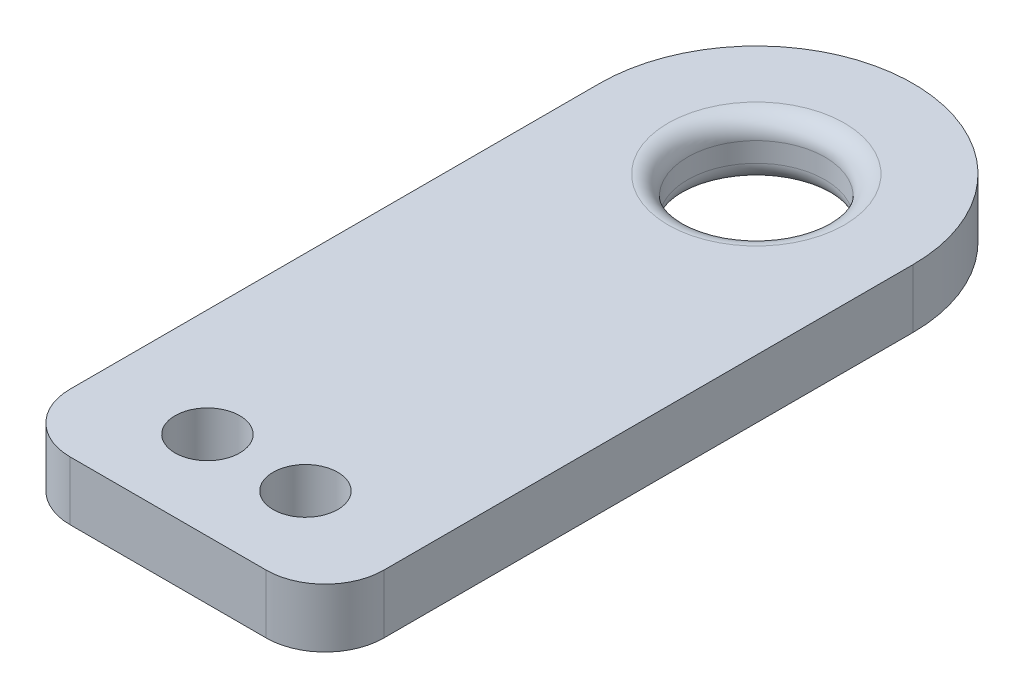
ISO-10303-21;
HEADER;
FILE_DESCRIPTION(('STEP AP214'),'2;1');
FILE_NAME('part.step','',(''),(''),'','','');
FILE_SCHEMA(('AUTOMOTIVE_DESIGN { 1 0 10303 214 1 1 1 1 }'));
ENDSEC;
DATA;
#1=APPLICATION_CONTEXT('core data for automotive mechanical design processes');
#2=APPLICATION_PROTOCOL_DEFINITION('international standard','automotive_design',2000,#1);
#3=PRODUCT_CONTEXT('',#1,'mechanical');
#4=PRODUCT('Part','Part','',(#3));
#5=PRODUCT_RELATED_PRODUCT_CATEGORY('part','',(#4));
#6=PRODUCT_DEFINITION_FORMATION('','',#4);
#7=PRODUCT_DEFINITION_CONTEXT('part definition',#1,'design');
#8=PRODUCT_DEFINITION('design','',#6,#7);
#9=PRODUCT_DEFINITION_SHAPE('','',#8);
#10=(LENGTH_UNIT() NAMED_UNIT(*) SI_UNIT(.MILLI.,.METRE.));
#11=(NAMED_UNIT(*) PLANE_ANGLE_UNIT() SI_UNIT($,.RADIAN.));
#12=(NAMED_UNIT(*) SI_UNIT($,.STERADIAN.) SOLID_ANGLE_UNIT());
#13=UNCERTAINTY_MEASURE_WITH_UNIT(LENGTH_MEASURE(1.E-05),#10,'distance_accuracy_value','');
#14=(GEOMETRIC_REPRESENTATION_CONTEXT(3) GLOBAL_UNCERTAINTY_ASSIGNED_CONTEXT((#13)) GLOBAL_UNIT_ASSIGNED_CONTEXT((#10,
#11,#12)) REPRESENTATION_CONTEXT('',''));
#15=CARTESIAN_POINT('',(0.,0.,0.));
#16=DIRECTION('',(0.,0.,1.));
#17=DIRECTION('',(1.,0.,0.));
#18=AXIS2_PLACEMENT_3D('',#15,#16,#17);
#19=CARTESIAN_POINT('',(0.,1.5,0.));
#20=DIRECTION('',(0.,-1.,0.));
#21=DIRECTION('',(0.,0.,-1.));
#22=AXIS2_PLACEMENT_3D('',#19,#20,#21);
#23=CYLINDRICAL_SURFACE('',#22,8.);
#24=DIRECTION('',(0.,-1.,0.));
#25=VECTOR('',#24,1.);
#26=CARTESIAN_POINT('',(-8.,1.5,0.));
#27=LINE('',#26,#25);
#28=CARTESIAN_POINT('',(-8.,1.5,0.));
#29=VERTEX_POINT('',#28);
#30=CARTESIAN_POINT('',(-8.,-1.5,0.));
#31=VERTEX_POINT('',#30);
#32=EDGE_CURVE('E114',#29,#31,#27,.T.);
#33=ORIENTED_EDGE('',*,*,#32,.F.);
#34=CARTESIAN_POINT('',(0.,1.5,0.));
#35=DIRECTION('',(0.,1.,0.));
#36=DIRECTION('',(0.,0.,1.));
#37=AXIS2_PLACEMENT_3D('',#34,#35,#36);
#38=CIRCLE('',#37,8.);
#39=CARTESIAN_POINT('',(8.,1.5,0.));
#40=VERTEX_POINT('',#39);
#41=EDGE_CURVE('E110',#40,#29,#38,.T.);
#42=ORIENTED_EDGE('',*,*,#41,.F.);
#43=DIRECTION('',(0.,-1.,0.));
#44=VECTOR('',#43,1.);
#45=CARTESIAN_POINT('',(8.,1.5,0.));
#46=LINE('',#45,#44);
#47=CARTESIAN_POINT('',(8.,-1.5,0.));
#48=VERTEX_POINT('',#47);
#49=EDGE_CURVE('E97',#40,#48,#46,.T.);
#50=ORIENTED_EDGE('',*,*,#49,.T.);
#51=CARTESIAN_POINT('',(0.,-1.5,0.));
#52=DIRECTION('',(0.,1.,0.));
#53=DIRECTION('',(0.,0.,1.));
#54=AXIS2_PLACEMENT_3D('',#51,#52,#53);
#55=CIRCLE('',#54,8.);
#56=EDGE_CURVE('E104',#48,#31,#55,.T.);
#57=ORIENTED_EDGE('',*,*,#56,.T.);
#58=EDGE_LOOP('',(#33,#42,#50,#57));
#59=FACE_BOUND('',#58,.T.);
#60=ADVANCED_FACE('F37',(#59),#23,.T.);
#61=CARTESIAN_POINT('',(0.,1.5,0.));
#62=DIRECTION('',(0.,1.,0.));
#63=DIRECTION('',(0.,0.,1.));
#64=AXIS2_PLACEMENT_3D('',#61,#62,#63);
#65=PLANE('',#64);
#66=CARTESIAN_POINT('',(0.,1.5,0.));
#67=DIRECTION('',(0.,1.,0.));
#68=DIRECTION('',(0.,0.,1.));
#69=AXIS2_PLACEMENT_3D('',#66,#67,#68);
#70=CIRCLE('',#69,4.5);
#71=CARTESIAN_POINT('',(0.,1.5,4.5));
#72=VERTEX_POINT('',#71);
#73=EDGE_CURVE('E120',#72,#72,#70,.F.);
#74=ORIENTED_EDGE('',*,*,#73,.T.);
#75=EDGE_LOOP('',(#74));
#76=FACE_BOUND('',#75,.T.);
#77=CARTESIAN_POINT('',(2.5,1.5,25.5));
#78=DIRECTION('',(0.,1.,0.));
#79=DIRECTION('',(0.,0.,1.));
#80=AXIS2_PLACEMENT_3D('',#77,#78,#79);
#81=CIRCLE('',#80,1.65);
#82=CARTESIAN_POINT('',(2.5,1.5,27.15));
#83=VERTEX_POINT('',#82);
#84=EDGE_CURVE('E159',#83,#83,#81,.T.);
#85=ORIENTED_EDGE('',*,*,#84,.F.);
#86=EDGE_LOOP('',(#85));
#87=FACE_BOUND('',#86,.T.);
#88=CARTESIAN_POINT('',(-2.5,1.5,25.5));
#89=DIRECTION('',(0.,1.,0.));
#90=DIRECTION('',(0.,0.,1.));
#91=AXIS2_PLACEMENT_3D('',#88,#89,#90);
#92=CIRCLE('',#91,1.65);
#93=CARTESIAN_POINT('',(-2.5,1.5,27.15));
#94=VERTEX_POINT('',#93);
#95=EDGE_CURVE('E164',#94,#94,#92,.T.);
#96=ORIENTED_EDGE('',*,*,#95,.F.);
#97=EDGE_LOOP('',(#96));
#98=FACE_BOUND('',#97,.T.);
#99=DIRECTION('',(0.,0.,1.));
#100=VECTOR('',#99,1.);
#101=CARTESIAN_POINT('',(-8.,1.5,0.));
#102=LINE('',#101,#100);
#103=CARTESIAN_POINT('',(-8.,1.5,27.));
#104=VERTEX_POINT('',#103);
#105=EDGE_CURVE('E100',#29,#104,#102,.T.);
#106=ORIENTED_EDGE('',*,*,#105,.T.);
#107=CARTESIAN_POINT('',(-5.,1.5,27.));
#108=DIRECTION('',(0.,1.,0.));
#109=DIRECTION('',(0.,0.,1.));
#110=AXIS2_PLACEMENT_3D('',#107,#108,#109);
#111=CIRCLE('',#110,3.);
#112=CARTESIAN_POINT('',(-5.,1.5,30.));
#113=VERTEX_POINT('',#112);
#114=EDGE_CURVE('E45',#104,#113,#111,.T.);
#115=ORIENTED_EDGE('',*,*,#114,.T.);
#116=DIRECTION('',(1.,0.,0.));
#117=VECTOR('',#116,1.);
#118=CARTESIAN_POINT('',(-8.,1.5,30.));
#119=LINE('',#118,#117);
#120=CARTESIAN_POINT('',(5.,1.5,30.));
#121=VERTEX_POINT('',#120);
#122=EDGE_CURVE('E145',#113,#121,#119,.T.);
#123=ORIENTED_EDGE('',*,*,#122,.T.);
#124=CARTESIAN_POINT('',(5.,1.5,27.));
#125=DIRECTION('',(0.,1.,0.));
#126=DIRECTION('',(0.,0.,1.));
#127=AXIS2_PLACEMENT_3D('',#124,#125,#126);
#128=CIRCLE('',#127,3.);
#129=CARTESIAN_POINT('',(8.,1.5,27.));
#130=VERTEX_POINT('',#129);
#131=EDGE_CURVE('E52',#121,#130,#128,.T.);
#132=ORIENTED_EDGE('',*,*,#131,.T.);
#133=DIRECTION('',(0.,0.,-1.));
#134=VECTOR('',#133,1.);
#135=CARTESIAN_POINT('',(8.,1.5,0.));
#136=LINE('',#135,#134);
#137=EDGE_CURVE('E116',#130,#40,#136,.T.);
#138=ORIENTED_EDGE('',*,*,#137,.T.);
#139=ORIENTED_EDGE('',*,*,#41,.T.);
#140=EDGE_LOOP('',(#106,#115,#123,#132,#138,#139));
#141=FACE_BOUND('',#140,.T.);
#142=ADVANCED_FACE('F144',(#76,#87,#98,#141),#65,.T.);
#143=CARTESIAN_POINT('',(0.,-1.5,0.));
#144=DIRECTION('',(0.,1.,0.));
#145=DIRECTION('',(0.,0.,1.));
#146=AXIS2_PLACEMENT_3D('',#143,#144,#145);
#147=PLANE('',#146);
#148=CARTESIAN_POINT('',(0.,-1.5,0.));
#149=DIRECTION('',(0.,1.,0.));
#150=DIRECTION('',(0.,0.,1.));
#151=AXIS2_PLACEMENT_3D('',#148,#149,#150);
#152=CIRCLE('',#151,4.5);
#153=CARTESIAN_POINT('',(0.,-1.5,4.5));
#154=VERTEX_POINT('',#153);
#155=EDGE_CURVE('E129',#154,#154,#152,.T.);
#156=ORIENTED_EDGE('',*,*,#155,.T.);
#157=EDGE_LOOP('',(#156));
#158=FACE_BOUND('',#157,.T.);
#159=CARTESIAN_POINT('',(2.5,-1.5,25.5));
#160=DIRECTION('',(0.,1.,0.));
#161=DIRECTION('',(0.,0.,1.));
#162=AXIS2_PLACEMENT_3D('',#159,#160,#161);
#163=CIRCLE('',#162,1.65);
#164=CARTESIAN_POINT('',(2.5,-1.5,27.15));
#165=VERTEX_POINT('',#164);
#166=EDGE_CURVE('E155',#165,#165,#163,.F.);
#167=ORIENTED_EDGE('',*,*,#166,.F.);
#168=EDGE_LOOP('',(#167));
#169=FACE_BOUND('',#168,.T.);
#170=CARTESIAN_POINT('',(-2.5,-1.5,25.5));
#171=DIRECTION('',(0.,1.,0.));
#172=DIRECTION('',(0.,0.,1.));
#173=AXIS2_PLACEMENT_3D('',#170,#171,#172);
#174=CIRCLE('',#173,1.65);
#175=CARTESIAN_POINT('',(-2.5,-1.5,27.15));
#176=VERTEX_POINT('',#175);
#177=EDGE_CURVE('E167',#176,#176,#174,.F.);
#178=ORIENTED_EDGE('',*,*,#177,.F.);
#179=EDGE_LOOP('',(#178));
#180=FACE_BOUND('',#179,.T.);
#181=DIRECTION('',(1.,0.,0.));
#182=VECTOR('',#181,1.);
#183=CARTESIAN_POINT('',(-8.,-1.5,30.));
#184=LINE('',#183,#182);
#185=CARTESIAN_POINT('',(-5.,-1.5,30.));
#186=VERTEX_POINT('',#185);
#187=CARTESIAN_POINT('',(5.,-1.5,30.));
#188=VERTEX_POINT('',#187);
#189=EDGE_CURVE('E101',#186,#188,#184,.T.);
#190=ORIENTED_EDGE('',*,*,#189,.F.);
#191=CARTESIAN_POINT('',(-5.,-1.5,27.));
#192=DIRECTION('',(0.,1.,0.));
#193=DIRECTION('',(0.,0.,1.));
#194=AXIS2_PLACEMENT_3D('',#191,#192,#193);
#195=CIRCLE('',#194,3.);
#196=CARTESIAN_POINT('',(-8.,-1.5,27.));
#197=VERTEX_POINT('',#196);
#198=EDGE_CURVE('E139',#186,#197,#195,.F.);
#199=ORIENTED_EDGE('',*,*,#198,.T.);
#200=DIRECTION('',(0.,0.,1.));
#201=VECTOR('',#200,1.);
#202=CARTESIAN_POINT('',(-8.,-1.5,0.));
#203=LINE('',#202,#201);
#204=EDGE_CURVE('E107',#31,#197,#203,.T.);
#205=ORIENTED_EDGE('',*,*,#204,.F.);
#206=ORIENTED_EDGE('',*,*,#56,.F.);
#207=DIRECTION('',(0.,0.,-1.));
#208=VECTOR('',#207,1.);
#209=CARTESIAN_POINT('',(8.,-1.5,0.));
#210=LINE('',#209,#208);
#211=CARTESIAN_POINT('',(8.,-1.5,27.));
#212=VERTEX_POINT('',#211);
#213=EDGE_CURVE('E93',#212,#48,#210,.T.);
#214=ORIENTED_EDGE('',*,*,#213,.F.);
#215=CARTESIAN_POINT('',(5.,-1.5,27.));
#216=DIRECTION('',(0.,1.,0.));
#217=DIRECTION('',(0.,0.,1.));
#218=AXIS2_PLACEMENT_3D('',#215,#216,#217);
#219=CIRCLE('',#218,3.);
#220=EDGE_CURVE('E137',#212,#188,#219,.F.);
#221=ORIENTED_EDGE('',*,*,#220,.T.);
#222=EDGE_LOOP('',(#190,#199,#205,#206,#214,#221));
#223=FACE_BOUND('',#222,.T.);
#224=ADVANCED_FACE('F106',(#158,#169,#180,#223),#147,.F.);
#225=CARTESIAN_POINT('',(-8.,1.5,0.));
#226=DIRECTION('',(1.,0.,0.));
#227=DIRECTION('',(0.,0.,-1.));
#228=AXIS2_PLACEMENT_3D('',#225,#226,#227);
#229=PLANE('',#228);
#230=ORIENTED_EDGE('',*,*,#204,.T.);
#231=DIRECTION('',(0.,-1.,0.));
#232=VECTOR('',#231,1.);
#233=CARTESIAN_POINT('',(-8.,1.5,27.));
#234=LINE('',#233,#232);
#235=EDGE_CURVE('E60',#197,#104,#234,.F.);
#236=ORIENTED_EDGE('',*,*,#235,.T.);
#237=ORIENTED_EDGE('',*,*,#105,.F.);
#238=ORIENTED_EDGE('',*,*,#32,.T.);
#239=EDGE_LOOP('',(#230,#236,#237,#238));
#240=FACE_BOUND('',#239,.T.);
#241=ADVANCED_FACE('F154',(#240),#229,.F.);
#242=CARTESIAN_POINT('',(-8.,1.5,30.));
#243=DIRECTION('',(0.,0.,-1.));
#244=DIRECTION('',(-1.,0.,0.));
#245=AXIS2_PLACEMENT_3D('',#242,#243,#244);
#246=PLANE('',#245);
#247=ORIENTED_EDGE('',*,*,#122,.F.);
#248=DIRECTION('',(0.,-1.,0.));
#249=VECTOR('',#248,1.);
#250=CARTESIAN_POINT('',(-5.,1.5,30.));
#251=LINE('',#250,#249);
#252=EDGE_CURVE('E134',#113,#186,#251,.T.);
#253=ORIENTED_EDGE('',*,*,#252,.T.);
#254=ORIENTED_EDGE('',*,*,#189,.T.);
#255=DIRECTION('',(0.,-1.,0.));
#256=VECTOR('',#255,1.);
#257=CARTESIAN_POINT('',(5.,1.5,30.));
#258=LINE('',#257,#256);
#259=EDGE_CURVE('E132',#188,#121,#258,.F.);
#260=ORIENTED_EDGE('',*,*,#259,.T.);
#261=EDGE_LOOP('',(#247,#253,#254,#260));
#262=FACE_BOUND('',#261,.T.);
#263=ADVANCED_FACE('F149',(#262),#246,.F.);
#264=CARTESIAN_POINT('',(8.,1.5,0.));
#265=DIRECTION('',(-1.,0.,0.));
#266=DIRECTION('',(0.,0.,1.));
#267=AXIS2_PLACEMENT_3D('',#264,#265,#266);
#268=PLANE('',#267);
#269=ORIENTED_EDGE('',*,*,#137,.F.);
#270=DIRECTION('',(0.,-1.,0.));
#271=VECTOR('',#270,1.);
#272=CARTESIAN_POINT('',(8.,1.5,27.));
#273=LINE('',#272,#271);
#274=EDGE_CURVE('E11',#130,#212,#273,.T.);
#275=ORIENTED_EDGE('',*,*,#274,.T.);
#276=ORIENTED_EDGE('',*,*,#213,.T.);
#277=ORIENTED_EDGE('',*,*,#49,.F.);
#278=EDGE_LOOP('',(#269,#275,#276,#277));
#279=FACE_BOUND('',#278,.T.);
#280=ADVANCED_FACE('F95',(#279),#268,.F.);
#281=CARTESIAN_POINT('',(-2.5,-1.501,25.5));
#282=DIRECTION('',(0.,1.,0.));
#283=DIRECTION('',(0.,0.,1.));
#284=AXIS2_PLACEMENT_3D('',#281,#282,#283);
#285=CYLINDRICAL_SURFACE('',#284,1.65);
#286=CARTESIAN_POINT('',(-2.5,1.5,27.15));
#287=CARTESIAN_POINT('',(-2.5,1.46875,27.15));
#288=CARTESIAN_POINT('',(-2.5,1.4375,27.15));
#289=CARTESIAN_POINT('',(-2.5,1.375,27.15));
#290=CARTESIAN_POINT('',(-2.5,1.34375,27.15));
#291=CARTESIAN_POINT('',(-2.5,1.28125,27.15));
#292=CARTESIAN_POINT('',(-2.5,1.25,27.15));
#293=CARTESIAN_POINT('',(-2.5,1.1875,27.15));
#294=CARTESIAN_POINT('',(-2.5,1.15625,27.15));
#295=CARTESIAN_POINT('',(-2.5,1.09375,27.15));
#296=CARTESIAN_POINT('',(-2.5,1.0625,27.15));
#297=CARTESIAN_POINT('',(-2.5,1.,27.15));
#298=CARTESIAN_POINT('',(-2.5,0.96875,27.15));
#299=CARTESIAN_POINT('',(-2.5,0.90625,27.15));
#300=CARTESIAN_POINT('',(-2.5,0.874999999999999,27.15));
#301=CARTESIAN_POINT('',(-2.5,0.8125,27.15));
#302=CARTESIAN_POINT('',(-2.5,0.78125,27.15));
#303=CARTESIAN_POINT('',(-2.5,0.71875,27.15));
#304=CARTESIAN_POINT('',(-2.5,0.6875,27.15));
#305=CARTESIAN_POINT('',(-2.5,0.625,27.15));
#306=CARTESIAN_POINT('',(-2.5,0.59375,27.15));
#307=CARTESIAN_POINT('',(-2.5,0.53125,27.15));
#308=CARTESIAN_POINT('',(-2.5,0.5,27.15));
#309=CARTESIAN_POINT('',(-2.5,0.4375,27.15));
#310=CARTESIAN_POINT('',(-2.5,0.40625,27.15));
#311=CARTESIAN_POINT('',(-2.5,0.34375,27.15));
#312=CARTESIAN_POINT('',(-2.5,0.3125,27.15));
#313=CARTESIAN_POINT('',(-2.5,0.25,27.15));
#314=CARTESIAN_POINT('',(-2.5,0.21875,27.15));
#315=CARTESIAN_POINT('',(-2.5,0.15625,27.15));
#316=CARTESIAN_POINT('',(-2.5,0.125,27.15));
#317=CARTESIAN_POINT('',(-2.5,0.0624999999999998,27.15));
#318=CARTESIAN_POINT('',(-2.5,0.0312499999999998,27.15));
#319=CARTESIAN_POINT('',(-2.5,-0.0312500000000002,27.15));
#320=CARTESIAN_POINT('',(-2.5,-0.0625000000000003,27.15));
#321=CARTESIAN_POINT('',(-2.5,-0.125,27.15));
#322=CARTESIAN_POINT('',(-2.5,-0.15625,27.15));
#323=CARTESIAN_POINT('',(-2.5,-0.21875,27.15));
#324=CARTESIAN_POINT('',(-2.5,-0.25,27.15));
#325=CARTESIAN_POINT('',(-2.5,-0.3125,27.15));
#326=CARTESIAN_POINT('',(-2.5,-0.34375,27.15));
#327=CARTESIAN_POINT('',(-2.5,-0.40625,27.15));
#328=CARTESIAN_POINT('',(-2.5,-0.4375,27.15));
#329=CARTESIAN_POINT('',(-2.5,-0.5,27.15));
#330=CARTESIAN_POINT('',(-2.5,-0.53125,27.15));
#331=CARTESIAN_POINT('',(-2.5,-0.59375,27.15));
#332=CARTESIAN_POINT('',(-2.5,-0.625,27.15));
#333=CARTESIAN_POINT('',(-2.5,-0.6875,27.15));
#334=CARTESIAN_POINT('',(-2.5,-0.71875,27.15));
#335=CARTESIAN_POINT('',(-2.5,-0.78125,27.15));
#336=CARTESIAN_POINT('',(-2.5,-0.8125,27.15));
#337=CARTESIAN_POINT('',(-2.5,-0.875,27.15));
#338=CARTESIAN_POINT('',(-2.5,-0.90625,27.15));
#339=CARTESIAN_POINT('',(-2.5,-0.96875,27.15));
#340=CARTESIAN_POINT('',(-2.5,-1.,27.15));
#341=CARTESIAN_POINT('',(-2.5,-1.0625,27.15));
#342=CARTESIAN_POINT('',(-2.5,-1.09375,27.15));
#343=CARTESIAN_POINT('',(-2.5,-1.15625,27.15));
#344=CARTESIAN_POINT('',(-2.5,-1.1875,27.15));
#345=CARTESIAN_POINT('',(-2.5,-1.25,27.15));
#346=CARTESIAN_POINT('',(-2.5,-1.28125,27.15));
#347=CARTESIAN_POINT('',(-2.5,-1.34375,27.15));
#348=CARTESIAN_POINT('',(-2.5,-1.375,27.15));
#349=CARTESIAN_POINT('',(-2.5,-1.4375,27.15));
#350=CARTESIAN_POINT('',(-2.5,-1.46875,27.15));
#351=CARTESIAN_POINT('',(-2.5,-1.5,27.15));
#352=B_SPLINE_CURVE_WITH_KNOTS('',3,(#286,#287,#288,#289,#290,#291,#292,#293,#294,#295,#296,
#297,#298,#299,#300,#301,#302,#303,#304,#305,#306,#307,#308,#309,#310,#311,#312,#313,#314,#315,
#316,#317,#318,#319,#320,#321,#322,#323,#324,#325,#326,#327,#328,#329,#330,#331,#332,#333,#334,
#335,#336,#337,#338,#339,#340,#341,#342,#343,#344,#345,#346,#347,#348,#349,#350,#351),
.UNSPECIFIED.,.F.,.F.,(4,2,2,2,2,2,2,2,2,2,2,2,2,2,2,2,2,2,2,2,2,2,2,2,2,2,2,2,2,2,2,2,4),(0.,
0.0937500000000001,0.1875,0.28125,0.375,0.46875,0.5625,0.65625,0.75,0.84375,0.9375,1.03125,
1.125,1.21875,1.3125,1.40625,1.5,1.59375,1.6875,1.78125,1.875,1.96875,2.0625,2.15625,2.25,
2.34375,2.4375,2.53125,2.625,2.71875,2.8125,2.90625,3.),.UNSPECIFIED.);
#353=EDGE_CURVE('BSEAM182',#94,#176,#352,.T.);
#354=ORIENTED_EDGE('',*,*,#95,.T.);
#355=ORIENTED_EDGE('',*,*,#177,.T.);
#356=ORIENTED_EDGE('',*,*,#353,.T.);
#357=ORIENTED_EDGE('',*,*,#353,.F.);
#358=EDGE_LOOP('',(#354,#356,#355,#357));
#359=FACE_BOUND('',#358,.T.);
#360=ADVANCED_FACE('F182',(#359),#285,.F.);
#361=CARTESIAN_POINT('',(2.5,-1.501,25.5));
#362=DIRECTION('',(0.,1.,0.));
#363=DIRECTION('',(0.,0.,1.));
#364=AXIS2_PLACEMENT_3D('',#361,#362,#363);
#365=CYLINDRICAL_SURFACE('',#364,1.65);
#366=CARTESIAN_POINT('',(2.5,1.5,27.15));
#367=CARTESIAN_POINT('',(2.5,1.46875,27.15));
#368=CARTESIAN_POINT('',(2.5,1.4375,27.15));
#369=CARTESIAN_POINT('',(2.5,1.375,27.15));
#370=CARTESIAN_POINT('',(2.5,1.34375,27.15));
#371=CARTESIAN_POINT('',(2.5,1.28125,27.15));
#372=CARTESIAN_POINT('',(2.5,1.25,27.15));
#373=CARTESIAN_POINT('',(2.5,1.1875,27.15));
#374=CARTESIAN_POINT('',(2.5,1.15625,27.15));
#375=CARTESIAN_POINT('',(2.5,1.09375,27.15));
#376=CARTESIAN_POINT('',(2.5,1.0625,27.15));
#377=CARTESIAN_POINT('',(2.5,1.,27.15));
#378=CARTESIAN_POINT('',(2.5,0.96875,27.15));
#379=CARTESIAN_POINT('',(2.5,0.90625,27.15));
#380=CARTESIAN_POINT('',(2.5,0.874999999999999,27.15));
#381=CARTESIAN_POINT('',(2.5,0.8125,27.15));
#382=CARTESIAN_POINT('',(2.5,0.78125,27.15));
#383=CARTESIAN_POINT('',(2.5,0.71875,27.15));
#384=CARTESIAN_POINT('',(2.5,0.6875,27.15));
#385=CARTESIAN_POINT('',(2.5,0.625,27.15));
#386=CARTESIAN_POINT('',(2.5,0.59375,27.15));
#387=CARTESIAN_POINT('',(2.5,0.53125,27.15));
#388=CARTESIAN_POINT('',(2.5,0.5,27.15));
#389=CARTESIAN_POINT('',(2.5,0.4375,27.15));
#390=CARTESIAN_POINT('',(2.5,0.40625,27.15));
#391=CARTESIAN_POINT('',(2.5,0.34375,27.15));
#392=CARTESIAN_POINT('',(2.5,0.3125,27.15));
#393=CARTESIAN_POINT('',(2.5,0.25,27.15));
#394=CARTESIAN_POINT('',(2.5,0.21875,27.15));
#395=CARTESIAN_POINT('',(2.5,0.15625,27.15));
#396=CARTESIAN_POINT('',(2.5,0.125,27.15));
#397=CARTESIAN_POINT('',(2.5,0.0624999999999998,27.15));
#398=CARTESIAN_POINT('',(2.5,0.0312499999999998,27.15));
#399=CARTESIAN_POINT('',(2.5,-0.0312500000000002,27.15));
#400=CARTESIAN_POINT('',(2.5,-0.0625000000000003,27.15));
#401=CARTESIAN_POINT('',(2.5,-0.125,27.15));
#402=CARTESIAN_POINT('',(2.5,-0.15625,27.15));
#403=CARTESIAN_POINT('',(2.5,-0.21875,27.15));
#404=CARTESIAN_POINT('',(2.5,-0.25,27.15));
#405=CARTESIAN_POINT('',(2.5,-0.3125,27.15));
#406=CARTESIAN_POINT('',(2.5,-0.34375,27.15));
#407=CARTESIAN_POINT('',(2.5,-0.40625,27.15));
#408=CARTESIAN_POINT('',(2.5,-0.4375,27.15));
#409=CARTESIAN_POINT('',(2.5,-0.5,27.15));
#410=CARTESIAN_POINT('',(2.5,-0.53125,27.15));
#411=CARTESIAN_POINT('',(2.5,-0.59375,27.15));
#412=CARTESIAN_POINT('',(2.5,-0.625,27.15));
#413=CARTESIAN_POINT('',(2.5,-0.6875,27.15));
#414=CARTESIAN_POINT('',(2.5,-0.71875,27.15));
#415=CARTESIAN_POINT('',(2.5,-0.78125,27.15));
#416=CARTESIAN_POINT('',(2.5,-0.8125,27.15));
#417=CARTESIAN_POINT('',(2.5,-0.875,27.15));
#418=CARTESIAN_POINT('',(2.5,-0.90625,27.15));
#419=CARTESIAN_POINT('',(2.5,-0.96875,27.15));
#420=CARTESIAN_POINT('',(2.5,-1.,27.15));
#421=CARTESIAN_POINT('',(2.5,-1.0625,27.15));
#422=CARTESIAN_POINT('',(2.5,-1.09375,27.15));
#423=CARTESIAN_POINT('',(2.5,-1.15625,27.15));
#424=CARTESIAN_POINT('',(2.5,-1.1875,27.15));
#425=CARTESIAN_POINT('',(2.5,-1.25,27.15));
#426=CARTESIAN_POINT('',(2.5,-1.28125,27.15));
#427=CARTESIAN_POINT('',(2.5,-1.34375,27.15));
#428=CARTESIAN_POINT('',(2.5,-1.375,27.15));
#429=CARTESIAN_POINT('',(2.5,-1.4375,27.15));
#430=CARTESIAN_POINT('',(2.5,-1.46875,27.15));
#431=CARTESIAN_POINT('',(2.5,-1.5,27.15));
#432=B_SPLINE_CURVE_WITH_KNOTS('',3,(#366,#367,#368,#369,#370,#371,#372,#373,#374,#375,#376,
#377,#378,#379,#380,#381,#382,#383,#384,#385,#386,#387,#388,#389,#390,#391,#392,#393,#394,#395,
#396,#397,#398,#399,#400,#401,#402,#403,#404,#405,#406,#407,#408,#409,#410,#411,#412,#413,#414,
#415,#416,#417,#418,#419,#420,#421,#422,#423,#424,#425,#426,#427,#428,#429,#430,#431),
.UNSPECIFIED.,.F.,.F.,(4,2,2,2,2,2,2,2,2,2,2,2,2,2,2,2,2,2,2,2,2,2,2,2,2,2,2,2,2,2,2,2,4),(0.,
0.0937500000000001,0.1875,0.28125,0.375,0.46875,0.5625,0.65625,0.75,0.84375,0.9375,1.03125,
1.125,1.21875,1.3125,1.40625,1.5,1.59375,1.6875,1.78125,1.875,1.96875,2.0625,2.15625,2.25,
2.34375,2.4375,2.53125,2.625,2.71875,2.8125,2.90625,3.),.UNSPECIFIED.);
#433=EDGE_CURVE('BSEAM173',#83,#165,#432,.T.);
#434=ORIENTED_EDGE('',*,*,#84,.T.);
#435=ORIENTED_EDGE('',*,*,#166,.T.);
#436=ORIENTED_EDGE('',*,*,#433,.T.);
#437=ORIENTED_EDGE('',*,*,#433,.F.);
#438=EDGE_LOOP('',(#434,#436,#435,#437));
#439=FACE_BOUND('',#438,.T.);
#440=ADVANCED_FACE('F173',(#439),#365,.F.);
#441=CARTESIAN_POINT('',(0.,1.501,0.));
#442=DIRECTION('',(0.,-1.,0.));
#443=DIRECTION('',(0.,0.,-1.));
#444=AXIS2_PLACEMENT_3D('',#441,#442,#443);
#445=CYLINDRICAL_SURFACE('',#444,3.5);
#446=CARTESIAN_POINT('',(0.,0.5,0.));
#447=DIRECTION('',(0.,1.,0.));
#448=DIRECTION('',(0.,0.,1.));
#449=AXIS2_PLACEMENT_3D('',#446,#447,#448);
#450=CIRCLE('',#449,3.5);
#451=CARTESIAN_POINT('',(0.,0.5,-3.5));
#452=VERTEX_POINT('',#451);
#453=EDGE_CURVE('E126',#452,#452,#450,.T.);
#454=CARTESIAN_POINT('',(0.,-0.5,0.));
#455=DIRECTION('',(0.,1.,0.));
#456=DIRECTION('',(0.,0.,1.));
#457=AXIS2_PLACEMENT_3D('',#454,#455,#456);
#458=CIRCLE('',#457,3.5);
#459=CARTESIAN_POINT('',(0.,-0.5,-3.5));
#460=VERTEX_POINT('',#459);
#461=EDGE_CURVE('E123',#460,#460,#458,.F.);
#462=CARTESIAN_POINT('',(0.,0.5,-3.5));
#463=CARTESIAN_POINT('',(0.,0.489583333333333,-3.5));
#464=CARTESIAN_POINT('',(0.,0.479166666666666,-3.5));
#465=CARTESIAN_POINT('',(0.,0.458333333333333,-3.5));
#466=CARTESIAN_POINT('',(0.,0.447916666666666,-3.5));
#467=CARTESIAN_POINT('',(0.,0.427083333333333,-3.5));
#468=CARTESIAN_POINT('',(0.,0.416666666666666,-3.5));
#469=CARTESIAN_POINT('',(0.,0.395833333333333,-3.5));
#470=CARTESIAN_POINT('',(0.,0.385416666666666,-3.5));
#471=CARTESIAN_POINT('',(0.,0.364583333333333,-3.5));
#472=CARTESIAN_POINT('',(0.,0.354166666666666,-3.5));
#473=CARTESIAN_POINT('',(0.,0.333333333333333,-3.5));
#474=CARTESIAN_POINT('',(0.,0.322916666666666,-3.5));
#475=CARTESIAN_POINT('',(0.,0.302083333333333,-3.5));
#476=CARTESIAN_POINT('',(0.,0.291666666666666,-3.5));
#477=CARTESIAN_POINT('',(0.,0.270833333333333,-3.5));
#478=CARTESIAN_POINT('',(0.,0.260416666666666,-3.5));
#479=CARTESIAN_POINT('',(0.,0.239583333333333,-3.5));
#480=CARTESIAN_POINT('',(0.,0.229166666666666,-3.5));
#481=CARTESIAN_POINT('',(0.,0.208333333333333,-3.5));
#482=CARTESIAN_POINT('',(0.,0.197916666666666,-3.5));
#483=CARTESIAN_POINT('',(0.,0.177083333333333,-3.5));
#484=CARTESIAN_POINT('',(0.,0.166666666666666,-3.5));
#485=CARTESIAN_POINT('',(0.,0.145833333333333,-3.5));
#486=CARTESIAN_POINT('',(0.,0.135416666666666,-3.5));
#487=CARTESIAN_POINT('',(0.,0.114583333333333,-3.5));
#488=CARTESIAN_POINT('',(0.,0.104166666666666,-3.5));
#489=CARTESIAN_POINT('',(0.,0.083333333333333,-3.5));
#490=CARTESIAN_POINT('',(0.,0.0729166666666663,-3.5));
#491=CARTESIAN_POINT('',(0.,0.0520833333333329,-3.5));
#492=CARTESIAN_POINT('',(0.,0.0416666666666663,-3.5));
#493=CARTESIAN_POINT('',(0.,0.0208333333333329,-3.5));
#494=CARTESIAN_POINT('',(0.,0.0104166666666662,-3.5));
#495=CARTESIAN_POINT('',(0.,-0.0104166666666671,-3.5));
#496=CARTESIAN_POINT('',(0.,-0.0208333333333338,-3.5));
#497=CARTESIAN_POINT('',(0.,-0.0416666666666671,-3.5));
#498=CARTESIAN_POINT('',(0.,-0.0520833333333338,-3.5));
#499=CARTESIAN_POINT('',(0.,-0.0729166666666672,-3.5));
#500=CARTESIAN_POINT('',(0.,-0.0833333333333338,-3.5));
#501=CARTESIAN_POINT('',(0.,-0.104166666666667,-3.5));
#502=CARTESIAN_POINT('',(0.,-0.114583333333334,-3.5));
#503=CARTESIAN_POINT('',(0.,-0.135416666666667,-3.5));
#504=CARTESIAN_POINT('',(0.,-0.145833333333334,-3.5));
#505=CARTESIAN_POINT('',(0.,-0.166666666666667,-3.5));
#506=CARTESIAN_POINT('',(0.,-0.177083333333334,-3.5));
#507=CARTESIAN_POINT('',(0.,-0.197916666666667,-3.5));
#508=CARTESIAN_POINT('',(0.,-0.208333333333334,-3.5));
#509=CARTESIAN_POINT('',(0.,-0.229166666666667,-3.5));
#510=CARTESIAN_POINT('',(0.,-0.239583333333334,-3.5));
#511=CARTESIAN_POINT('',(0.,-0.260416666666667,-3.5));
#512=CARTESIAN_POINT('',(0.,-0.270833333333334,-3.5));
#513=CARTESIAN_POINT('',(0.,-0.291666666666667,-3.5));
#514=CARTESIAN_POINT('',(0.,-0.302083333333334,-3.5));
#515=CARTESIAN_POINT('',(0.,-0.322916666666667,-3.5));
#516=CARTESIAN_POINT('',(0.,-0.333333333333334,-3.5));
#517=CARTESIAN_POINT('',(0.,-0.354166666666667,-3.5));
#518=CARTESIAN_POINT('',(0.,-0.364583333333334,-3.5));
#519=CARTESIAN_POINT('',(0.,-0.385416666666667,-3.5));
#520=CARTESIAN_POINT('',(0.,-0.395833333333334,-3.5));
#521=CARTESIAN_POINT('',(0.,-0.416666666666667,-3.5));
#522=CARTESIAN_POINT('',(0.,-0.427083333333334,-3.5));
#523=CARTESIAN_POINT('',(0.,-0.447916666666667,-3.5));
#524=CARTESIAN_POINT('',(0.,-0.458333333333334,-3.5));
#525=CARTESIAN_POINT('',(0.,-0.479166666666667,-3.5));
#526=CARTESIAN_POINT('',(0.,-0.489583333333334,-3.5));
#527=CARTESIAN_POINT('',(0.,-0.5,-3.5));
#528=B_SPLINE_CURVE_WITH_KNOTS('',3,(#462,#463,#464,#465,#466,#467,#468,#469,#470,#471,#472,
#473,#474,#475,#476,#477,#478,#479,#480,#481,#482,#483,#484,#485,#486,#487,#488,#489,#490,#491,
#492,#493,#494,#495,#496,#497,#498,#499,#500,#501,#502,#503,#504,#505,#506,#507,#508,#509,#510,
#511,#512,#513,#514,#515,#516,#517,#518,#519,#520,#521,#522,#523,#524,#525,#526,#527),
.UNSPECIFIED.,.F.,.F.,(4,2,2,2,2,2,2,2,2,2,2,2,2,2,2,2,2,2,2,2,2,2,2,2,2,2,2,2,2,2,2,2,4),(0.,
0.03125,0.0625000000000001,0.0937500000000001,0.125,0.15625,0.1875,0.21875,0.25,0.28125,0.3125,
0.34375,0.375,0.40625,0.4375,0.46875,0.5,0.53125,0.5625,0.59375,0.625,0.65625,0.6875,0.71875,
0.75,0.78125,0.8125,0.84375,0.875,0.90625,0.9375,0.96875,1.),.UNSPECIFIED.);
#529=EDGE_CURVE('BSEAM206',#452,#460,#528,.T.);
#530=ORIENTED_EDGE('',*,*,#453,.T.);
#531=ORIENTED_EDGE('',*,*,#461,.T.);
#532=ORIENTED_EDGE('',*,*,#529,.T.);
#533=ORIENTED_EDGE('',*,*,#529,.F.);
#534=EDGE_LOOP('',(#530,#532,#531,#533));
#535=FACE_BOUND('',#534,.T.);
#536=ADVANCED_FACE('F206',(#535),#445,.F.);
#537=CARTESIAN_POINT('',(0.,0.5,0.));
#538=DIRECTION('',(0.,1.,0.));
#539=DIRECTION('',(0.,0.,1.));
#540=AXIS2_PLACEMENT_3D('',#537,#538,#539);
#541=TOROIDAL_SURFACE('',#540,4.5,1.);
#542=ORIENTED_EDGE('',*,*,#453,.F.);
#543=EDGE_LOOP('',(#542));
#544=FACE_BOUND('',#543,.T.);
#545=ORIENTED_EDGE('',*,*,#73,.F.);
#546=EDGE_LOOP('',(#545));
#547=FACE_BOUND('',#546,.T.);
#548=ADVANCED_FACE('F202',(#544,#547),#541,.T.);
#549=CARTESIAN_POINT('',(0.,-0.5,0.));
#550=DIRECTION('',(0.,1.,0.));
#551=DIRECTION('',(0.,0.,1.));
#552=AXIS2_PLACEMENT_3D('',#549,#550,#551);
#553=TOROIDAL_SURFACE('',#552,4.5,1.);
#554=ORIENTED_EDGE('',*,*,#155,.F.);
#555=EDGE_LOOP('',(#554));
#556=FACE_BOUND('',#555,.T.);
#557=ORIENTED_EDGE('',*,*,#461,.F.);
#558=EDGE_LOOP('',(#557));
#559=FACE_BOUND('',#558,.T.);
#560=ADVANCED_FACE('F205',(#556,#559),#553,.T.);
#561=CARTESIAN_POINT('',(-5.,1.5,27.));
#562=DIRECTION('',(0.,-1.,0.));
#563=DIRECTION('',(0.,0.,-1.));
#564=AXIS2_PLACEMENT_3D('',#561,#562,#563);
#565=CYLINDRICAL_SURFACE('',#564,3.);
#566=ORIENTED_EDGE('',*,*,#114,.F.);
#567=ORIENTED_EDGE('',*,*,#235,.F.);
#568=ORIENTED_EDGE('',*,*,#198,.F.);
#569=ORIENTED_EDGE('',*,*,#252,.F.);
#570=EDGE_LOOP('',(#566,#567,#568,#569));
#571=FACE_BOUND('',#570,.T.);
#572=ADVANCED_FACE('F153',(#571),#565,.T.);
#573=CARTESIAN_POINT('',(5.,1.5,27.));
#574=DIRECTION('',(0.,-1.,0.));
#575=DIRECTION('',(0.,0.,-1.));
#576=AXIS2_PLACEMENT_3D('',#573,#574,#575);
#577=CYLINDRICAL_SURFACE('',#576,3.);
#578=ORIENTED_EDGE('',*,*,#131,.F.);
#579=ORIENTED_EDGE('',*,*,#259,.F.);
#580=ORIENTED_EDGE('',*,*,#220,.F.);
#581=ORIENTED_EDGE('',*,*,#274,.F.);
#582=EDGE_LOOP('',(#578,#579,#580,#581));
#583=FACE_BOUND('',#582,.T.);
#584=ADVANCED_FACE('F39',(#583),#577,.T.);
#585=CLOSED_SHELL('',(#60,#142,#224,#241,#263,#280,#360,#440,#536,#548,#560,#572,#584));
#586=MANIFOLD_SOLID_BREP('B2',#585);
#587=ADVANCED_BREP_SHAPE_REPRESENTATION('',(#18,#586),#14);
#588=SHAPE_DEFINITION_REPRESENTATION(#9,#587);
ENDSEC;
END-ISO-10303-21;
